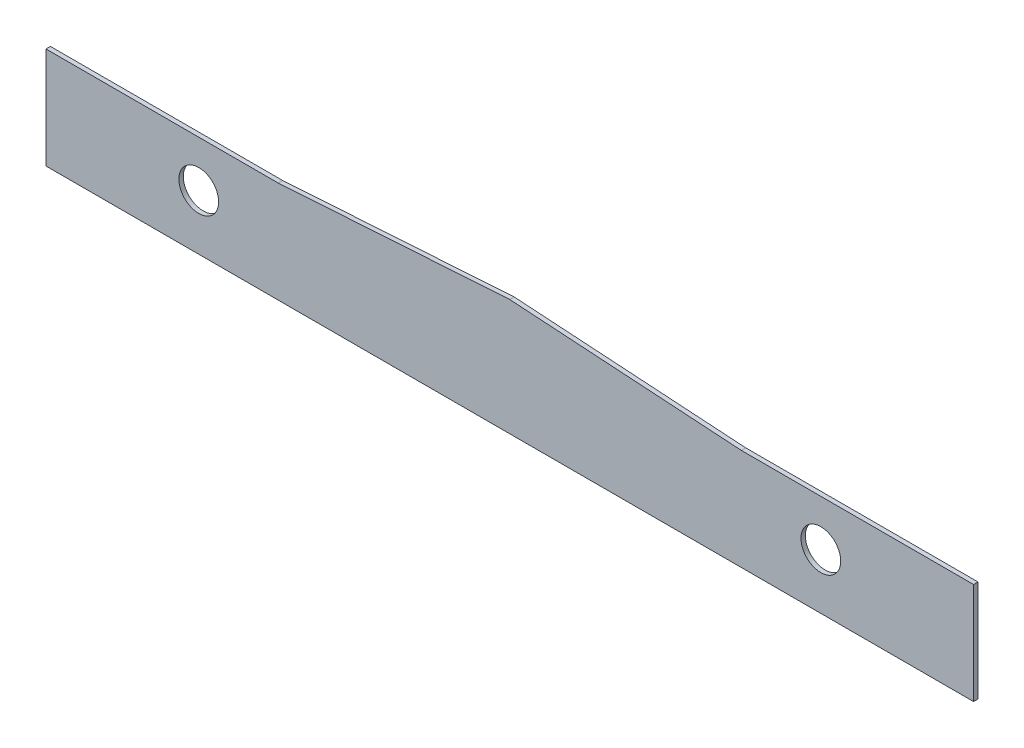
ISO-10303-21;
HEADER;
FILE_DESCRIPTION(('STEP AP214'),'2;1');
FILE_NAME('part.step','',(''),(''),'','','');
FILE_SCHEMA(('AUTOMOTIVE_DESIGN { 1 0 10303 214 1 1 1 1 }'));
ENDSEC;
DATA;
#1=APPLICATION_CONTEXT('core data for automotive mechanical design processes');
#2=APPLICATION_PROTOCOL_DEFINITION('international standard','automotive_design',2000,#1);
#3=PRODUCT_CONTEXT('',#1,'mechanical');
#4=PRODUCT('Part','Part','',(#3));
#5=PRODUCT_RELATED_PRODUCT_CATEGORY('part','',(#4));
#6=PRODUCT_DEFINITION_FORMATION('','',#4);
#7=PRODUCT_DEFINITION_CONTEXT('part definition',#1,'design');
#8=PRODUCT_DEFINITION('design','',#6,#7);
#9=PRODUCT_DEFINITION_SHAPE('','',#8);
#10=(LENGTH_UNIT() NAMED_UNIT(*) SI_UNIT(.MILLI.,.METRE.));
#11=(NAMED_UNIT(*) PLANE_ANGLE_UNIT() SI_UNIT($,.RADIAN.));
#12=(NAMED_UNIT(*) SI_UNIT($,.STERADIAN.) SOLID_ANGLE_UNIT());
#13=UNCERTAINTY_MEASURE_WITH_UNIT(LENGTH_MEASURE(1.E-05),#10,'distance_accuracy_value','');
#14=(GEOMETRIC_REPRESENTATION_CONTEXT(3) GLOBAL_UNCERTAINTY_ASSIGNED_CONTEXT((#13)) GLOBAL_UNIT_ASSIGNED_CONTEXT((#10,
#11,#12)) REPRESENTATION_CONTEXT('',''));
#15=CARTESIAN_POINT('',(0.,0.,0.));
#16=DIRECTION('',(0.,0.,1.));
#17=DIRECTION('',(1.,0.,0.));
#18=AXIS2_PLACEMENT_3D('',#15,#16,#17);
#19=CARTESIAN_POINT('',(210.,22.96,2.));
#20=DIRECTION('',(0.,-1.,0.));
#21=DIRECTION('',(1.,0.,0.));
#22=AXIS2_PLACEMENT_3D('',#19,#20,#21);
#23=PLANE('',#22);
#24=DIRECTION('',(0.,0.,1.));
#25=VECTOR('',#24,1.);
#26=CARTESIAN_POINT('',(-104.844657179424,22.96,-105.061669657459));
#27=LINE('',#26,#25);
#28=CARTESIAN_POINT('',(-104.844657179424,22.96,0.));
#29=VERTEX_POINT('',#28);
#30=CARTESIAN_POINT('',(-104.844657179424,22.96,2.));
#31=VERTEX_POINT('',#30);
#32=EDGE_CURVE('E94',#29,#31,#27,.T.);
#33=ORIENTED_EDGE('',*,*,#32,.F.);
#34=DIRECTION('',(-1.,0.,0.));
#35=VECTOR('',#34,1.);
#36=CARTESIAN_POINT('',(210.,22.96,0.));
#37=LINE('',#36,#35);
#38=CARTESIAN_POINT('',(-210.,22.96,0.));
#39=VERTEX_POINT('',#38);
#40=EDGE_CURVE('E133',#29,#39,#37,.T.);
#41=ORIENTED_EDGE('',*,*,#40,.T.);
#42=DIRECTION('',(0.,0.,-1.));
#43=VECTOR('',#42,1.);
#44=CARTESIAN_POINT('',(-210.,22.96,2.));
#45=LINE('',#44,#43);
#46=CARTESIAN_POINT('',(-210.,22.96,2.));
#47=VERTEX_POINT('',#46);
#48=EDGE_CURVE('E116',#47,#39,#45,.T.);
#49=ORIENTED_EDGE('',*,*,#48,.F.);
#50=DIRECTION('',(-1.,0.,0.));
#51=VECTOR('',#50,1.);
#52=CARTESIAN_POINT('',(210.,22.96,2.));
#53=LINE('',#52,#51);
#54=EDGE_CURVE('E110',#31,#47,#53,.T.);
#55=ORIENTED_EDGE('',*,*,#54,.F.);
#56=EDGE_LOOP('',(#33,#41,#49,#55));
#57=FACE_BOUND('',#56,.T.);
#58=ADVANCED_FACE('F35',(#57),#23,.F.);
#59=CARTESIAN_POINT('',(-210.,-22.96,2.));
#60=DIRECTION('',(1.,0.,0.));
#61=DIRECTION('',(0.,0.,-1.));
#62=AXIS2_PLACEMENT_3D('',#59,#60,#61);
#63=PLANE('',#62);
#64=DIRECTION('',(0.,-1.,0.));
#65=VECTOR('',#64,1.);
#66=CARTESIAN_POINT('',(-210.,-22.96,0.));
#67=LINE('',#66,#65);
#68=CARTESIAN_POINT('',(-210.,-22.96,0.));
#69=VERTEX_POINT('',#68);
#70=EDGE_CURVE('E125',#39,#69,#67,.T.);
#71=ORIENTED_EDGE('',*,*,#70,.T.);
#72=DIRECTION('',(0.,0.,-1.));
#73=VECTOR('',#72,1.);
#74=CARTESIAN_POINT('',(-210.,-22.96,2.));
#75=LINE('',#74,#73);
#76=CARTESIAN_POINT('',(-210.,-22.96,2.));
#77=VERTEX_POINT('',#76);
#78=EDGE_CURVE('E11',#77,#69,#75,.T.);
#79=ORIENTED_EDGE('',*,*,#78,.F.);
#80=DIRECTION('',(0.,-1.,0.));
#81=VECTOR('',#80,1.);
#82=CARTESIAN_POINT('',(-210.,-22.96,2.));
#83=LINE('',#82,#81);
#84=EDGE_CURVE('E135',#47,#77,#83,.T.);
#85=ORIENTED_EDGE('',*,*,#84,.F.);
#86=ORIENTED_EDGE('',*,*,#48,.T.);
#87=EDGE_LOOP('',(#71,#79,#85,#86));
#88=FACE_BOUND('',#87,.T.);
#89=ADVANCED_FACE('F37',(#88),#63,.F.);
#90=CARTESIAN_POINT('',(210.,-22.96,2.));
#91=DIRECTION('',(0.,1.,0.));
#92=DIRECTION('',(-1.,0.,0.));
#93=AXIS2_PLACEMENT_3D('',#90,#91,#92);
#94=PLANE('',#93);
#95=DIRECTION('',(1.,0.,0.));
#96=VECTOR('',#95,1.);
#97=CARTESIAN_POINT('',(210.,-22.96,0.));
#98=LINE('',#97,#96);
#99=CARTESIAN_POINT('',(210.,-22.96,0.));
#100=VERTEX_POINT('',#99);
#101=EDGE_CURVE('E128',#69,#100,#98,.T.);
#102=ORIENTED_EDGE('',*,*,#101,.T.);
#103=DIRECTION('',(0.,0.,-1.));
#104=VECTOR('',#103,1.);
#105=CARTESIAN_POINT('',(210.,-22.96,2.));
#106=LINE('',#105,#104);
#107=CARTESIAN_POINT('',(210.,-22.96,2.));
#108=VERTEX_POINT('',#107);
#109=EDGE_CURVE('E43',#108,#100,#106,.T.);
#110=ORIENTED_EDGE('',*,*,#109,.F.);
#111=DIRECTION('',(1.,0.,0.));
#112=VECTOR('',#111,1.);
#113=CARTESIAN_POINT('',(210.,-22.96,2.));
#114=LINE('',#113,#112);
#115=EDGE_CURVE('E121',#77,#108,#114,.T.);
#116=ORIENTED_EDGE('',*,*,#115,.F.);
#117=ORIENTED_EDGE('',*,*,#78,.T.);
#118=EDGE_LOOP('',(#102,#110,#116,#117));
#119=FACE_BOUND('',#118,.T.);
#120=ADVANCED_FACE('F172',(#119),#94,.F.);
#121=CARTESIAN_POINT('',(210.,-22.96,2.));
#122=DIRECTION('',(-1.,0.,0.));
#123=DIRECTION('',(0.,0.,1.));
#124=AXIS2_PLACEMENT_3D('',#121,#122,#123);
#125=PLANE('',#124);
#126=DIRECTION('',(0.,1.,0.));
#127=VECTOR('',#126,1.);
#128=CARTESIAN_POINT('',(210.,-22.96,0.));
#129=LINE('',#128,#127);
#130=CARTESIAN_POINT('',(210.,22.96,0.));
#131=VERTEX_POINT('',#130);
#132=EDGE_CURVE('E131',#100,#131,#129,.T.);
#133=ORIENTED_EDGE('',*,*,#132,.T.);
#134=DIRECTION('',(0.,0.,-1.));
#135=VECTOR('',#134,1.);
#136=CARTESIAN_POINT('',(210.,22.96,2.));
#137=LINE('',#136,#135);
#138=CARTESIAN_POINT('',(210.,22.96,2.));
#139=VERTEX_POINT('',#138);
#140=EDGE_CURVE('E137',#139,#131,#137,.T.);
#141=ORIENTED_EDGE('',*,*,#140,.F.);
#142=DIRECTION('',(0.,1.,0.));
#143=VECTOR('',#142,1.);
#144=CARTESIAN_POINT('',(210.,-22.96,2.));
#145=LINE('',#144,#143);
#146=EDGE_CURVE('E119',#108,#139,#145,.T.);
#147=ORIENTED_EDGE('',*,*,#146,.F.);
#148=ORIENTED_EDGE('',*,*,#109,.T.);
#149=EDGE_LOOP('',(#133,#141,#147,#148));
#150=FACE_BOUND('',#149,.T.);
#151=ADVANCED_FACE('F143',(#150),#125,.F.);
#152=CARTESIAN_POINT('',(104.844657179424,22.96,0.));
#153=VERTEX_POINT('',#152);
#154=EDGE_CURVE('E55',#131,#153,#37,.T.);
#155=ORIENTED_EDGE('',*,*,#154,.T.);
#156=DIRECTION('',(0.,0.,1.));
#157=VECTOR('',#156,1.);
#158=CARTESIAN_POINT('',(104.844657179424,22.96,-105.061669657459));
#159=LINE('',#158,#157);
#160=CARTESIAN_POINT('',(104.844657179424,22.96,2.));
#161=VERTEX_POINT('',#160);
#162=EDGE_CURVE('E50',#153,#161,#159,.T.);
#163=ORIENTED_EDGE('',*,*,#162,.T.);
#164=EDGE_CURVE('E118',#139,#161,#53,.T.);
#165=ORIENTED_EDGE('',*,*,#164,.F.);
#166=ORIENTED_EDGE('',*,*,#140,.T.);
#167=EDGE_LOOP('',(#155,#163,#165,#166));
#168=FACE_BOUND('',#167,.T.);
#169=ADVANCED_FACE('F180',(#168),#23,.F.);
#170=CARTESIAN_POINT('',(0.,0.,2.));
#171=DIRECTION('',(0.,0.,1.));
#172=DIRECTION('',(1.,0.,0.));
#173=AXIS2_PLACEMENT_3D('',#170,#171,#172);
#174=PLANE('',#173);
#175=DIRECTION('',(0.99793442766765,0.0642407820285571,0.));
#176=VECTOR('',#175,1.);
#177=CARTESIAN_POINT('',(-104.844657179424,22.96,2.));
#178=LINE('',#177,#176);
#179=CARTESIAN_POINT('',(0.,29.7092438200211,2.));
#180=VERTEX_POINT('',#179);
#181=EDGE_CURVE('E98',#31,#180,#178,.T.);
#182=ORIENTED_EDGE('',*,*,#181,.F.);
#183=ORIENTED_EDGE('',*,*,#54,.T.);
#184=ORIENTED_EDGE('',*,*,#84,.T.);
#185=ORIENTED_EDGE('',*,*,#115,.T.);
#186=ORIENTED_EDGE('',*,*,#146,.T.);
#187=ORIENTED_EDGE('',*,*,#164,.T.);
#188=DIRECTION('',(-0.99793442766765,0.0642407820285571,0.));
#189=VECTOR('',#188,1.);
#190=CARTESIAN_POINT('',(104.844657179424,22.96,2.));
#191=LINE('',#190,#189);
#192=EDGE_CURVE('E113',#161,#180,#191,.T.);
#193=ORIENTED_EDGE('',*,*,#192,.T.);
#194=EDGE_LOOP('',(#182,#183,#184,#185,#186,#187,#193));
#195=FACE_BOUND('',#194,.T.);
#196=CARTESIAN_POINT('',(140.833333333333,2.04000000000001,2.));
#197=DIRECTION('',(0.,0.,-1.));
#198=DIRECTION('',(-1.,0.,0.));
#199=AXIS2_PLACEMENT_3D('',#196,#197,#198);
#200=CIRCLE('',#199,9.00000000000001);
#201=CARTESIAN_POINT('',(131.833333333333,2.04000000000001,2.));
#202=VERTEX_POINT('',#201);
#203=EDGE_CURVE('E153',#202,#202,#200,.T.);
#204=ORIENTED_EDGE('',*,*,#203,.T.);
#205=EDGE_LOOP('',(#204));
#206=FACE_BOUND('',#205,.T.);
#207=CARTESIAN_POINT('',(-140.833333333333,2.04000000000001,2.));
#208=DIRECTION('',(0.,0.,1.));
#209=DIRECTION('',(1.,0.,0.));
#210=AXIS2_PLACEMENT_3D('',#207,#208,#209);
#211=CIRCLE('',#210,9.00000000000001);
#212=CARTESIAN_POINT('',(-131.833333333333,2.04000000000001,2.));
#213=VERTEX_POINT('',#212);
#214=EDGE_CURVE('E164',#213,#213,#211,.T.);
#215=ORIENTED_EDGE('',*,*,#214,.F.);
#216=EDGE_LOOP('',(#215));
#217=FACE_BOUND('',#216,.T.);
#218=ADVANCED_FACE('F107',(#195,#206,#217),#174,.T.);
#219=CARTESIAN_POINT('',(0.,0.,0.));
#220=DIRECTION('',(0.,0.,1.));
#221=DIRECTION('',(1.,0.,0.));
#222=AXIS2_PLACEMENT_3D('',#219,#220,#221);
#223=PLANE('',#222);
#224=ORIENTED_EDGE('',*,*,#40,.F.);
#225=DIRECTION('',(-0.99793442766765,-0.0642407820285571,0.));
#226=VECTOR('',#225,1.);
#227=CARTESIAN_POINT('',(-104.844657179424,22.96,0.));
#228=LINE('',#227,#226);
#229=CARTESIAN_POINT('',(0.,29.7092438200211,0.));
#230=VERTEX_POINT('',#229);
#231=EDGE_CURVE('E100',#230,#29,#228,.T.);
#232=ORIENTED_EDGE('',*,*,#231,.F.);
#233=DIRECTION('',(0.99793442766765,-0.0642407820285571,0.));
#234=VECTOR('',#233,1.);
#235=CARTESIAN_POINT('',(104.844657179424,22.96,0.));
#236=LINE('',#235,#234);
#237=EDGE_CURVE('E151',#230,#153,#236,.T.);
#238=ORIENTED_EDGE('',*,*,#237,.T.);
#239=ORIENTED_EDGE('',*,*,#154,.F.);
#240=ORIENTED_EDGE('',*,*,#132,.F.);
#241=ORIENTED_EDGE('',*,*,#101,.F.);
#242=ORIENTED_EDGE('',*,*,#70,.F.);
#243=EDGE_LOOP('',(#224,#232,#238,#239,#240,#241,#242));
#244=FACE_BOUND('',#243,.T.);
#245=CARTESIAN_POINT('',(140.833333333333,2.04000000000001,0.));
#246=DIRECTION('',(0.,0.,-1.));
#247=DIRECTION('',(-1.,0.,0.));
#248=AXIS2_PLACEMENT_3D('',#245,#246,#247);
#249=CIRCLE('',#248,9.00000000000001);
#250=CARTESIAN_POINT('',(131.833333333333,2.04000000000001,0.));
#251=VERTEX_POINT('',#250);
#252=EDGE_CURVE('E161',#251,#251,#249,.T.);
#253=ORIENTED_EDGE('',*,*,#252,.F.);
#254=EDGE_LOOP('',(#253));
#255=FACE_BOUND('',#254,.T.);
#256=CARTESIAN_POINT('',(-140.833333333333,2.04000000000001,0.));
#257=DIRECTION('',(0.,0.,1.));
#258=DIRECTION('',(1.,0.,0.));
#259=AXIS2_PLACEMENT_3D('',#256,#257,#258);
#260=CIRCLE('',#259,9.00000000000001);
#261=CARTESIAN_POINT('',(-131.833333333333,2.04000000000001,0.));
#262=VERTEX_POINT('',#261);
#263=EDGE_CURVE('E129',#262,#262,#260,.T.);
#264=ORIENTED_EDGE('',*,*,#263,.T.);
#265=EDGE_LOOP('',(#264));
#266=FACE_BOUND('',#265,.T.);
#267=ADVANCED_FACE('F147',(#244,#255,#266),#223,.F.);
#268=CARTESIAN_POINT('',(-140.833333333333,2.04000000000001,0.));
#269=DIRECTION('',(0.,0.,1.));
#270=DIRECTION('',(1.,0.,0.));
#271=AXIS2_PLACEMENT_3D('',#268,#269,#270);
#272=CYLINDRICAL_SURFACE('',#271,9.00000000000001);
#273=ORIENTED_EDGE('',*,*,#263,.F.);
#274=EDGE_LOOP('',(#273));
#275=FACE_BOUND('',#274,.T.);
#276=ORIENTED_EDGE('',*,*,#214,.T.);
#277=EDGE_LOOP('',(#276));
#278=FACE_BOUND('',#277,.T.);
#279=ADVANCED_FACE('F206',(#275,#278),#272,.F.);
#280=CARTESIAN_POINT('',(140.833333333333,2.04000000000001,0.));
#281=DIRECTION('',(0.,0.,1.));
#282=DIRECTION('',(1.,0.,0.));
#283=AXIS2_PLACEMENT_3D('',#280,#281,#282);
#284=CYLINDRICAL_SURFACE('',#283,9.00000000000001);
#285=ORIENTED_EDGE('',*,*,#252,.T.);
#286=EDGE_LOOP('',(#285));
#287=FACE_BOUND('',#286,.T.);
#288=ORIENTED_EDGE('',*,*,#203,.F.);
#289=EDGE_LOOP('',(#288));
#290=FACE_BOUND('',#289,.T.);
#291=ADVANCED_FACE('F209',(#287,#290),#284,.F.);
#292=CARTESIAN_POINT('',(104.844657179424,22.96,-105.061669657459));
#293=DIRECTION('',(0.0642407820285571,0.99793442766765,0.));
#294=DIRECTION('',(-0.99793442766765,0.0642407820285571,0.));
#295=AXIS2_PLACEMENT_3D('',#292,#293,#294);
#296=PLANE('',#295);
#297=ORIENTED_EDGE('',*,*,#237,.F.);
#298=DIRECTION('',(0.,0.,1.));
#299=VECTOR('',#298,1.);
#300=CARTESIAN_POINT('',(0.,29.7092438200211,-105.061669657459));
#301=LINE('',#300,#299);
#302=EDGE_CURVE('E154',#230,#180,#301,.T.);
#303=ORIENTED_EDGE('',*,*,#302,.T.);
#304=ORIENTED_EDGE('',*,*,#192,.F.);
#305=ORIENTED_EDGE('',*,*,#162,.F.);
#306=EDGE_LOOP('',(#297,#303,#304,#305));
#307=FACE_BOUND('',#306,.T.);
#308=ADVANCED_FACE('F156',(#307),#296,.T.);
#309=CARTESIAN_POINT('',(-104.844657179424,22.96,-105.061669657459));
#310=DIRECTION('',(0.0642407820285571,-0.99793442766765,0.));
#311=DIRECTION('',(0.99793442766765,0.0642407820285571,0.));
#312=AXIS2_PLACEMENT_3D('',#309,#310,#311);
#313=PLANE('',#312);
#314=ORIENTED_EDGE('',*,*,#302,.F.);
#315=ORIENTED_EDGE('',*,*,#231,.T.);
#316=ORIENTED_EDGE('',*,*,#32,.T.);
#317=ORIENTED_EDGE('',*,*,#181,.T.);
#318=EDGE_LOOP('',(#314,#315,#316,#317));
#319=FACE_BOUND('',#318,.T.);
#320=ADVANCED_FACE('F97',(#319),#313,.F.);
#321=CLOSED_SHELL('',(#58,#89,#120,#151,#169,#218,#267,#279,#291,#308,#320));
#322=MANIFOLD_SOLID_BREP('B2',#321);
#323=ADVANCED_BREP_SHAPE_REPRESENTATION('',(#18,#322),#14);
#324=SHAPE_DEFINITION_REPRESENTATION(#9,#323);
ENDSEC;
END-ISO-10303-21;
